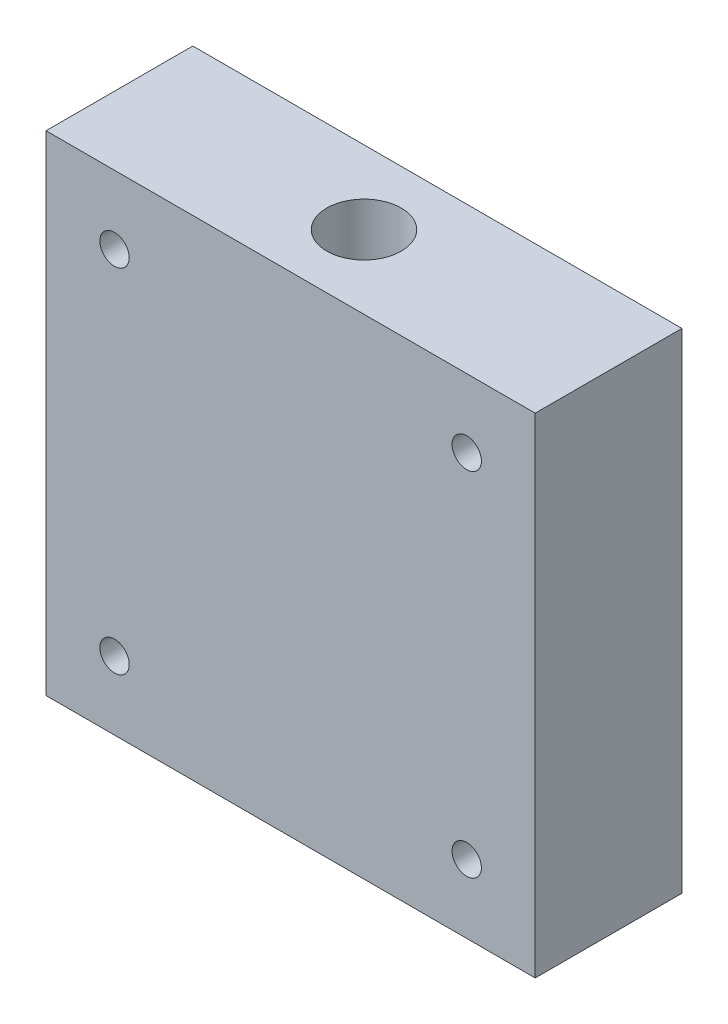
ISO-10303-21;
HEADER;
FILE_DESCRIPTION(('STEP AP214'),'2;1');
FILE_NAME('part.step','',(''),(''),'','','');
FILE_SCHEMA(('AUTOMOTIVE_DESIGN { 1 0 10303 214 1 1 1 1 }'));
ENDSEC;
DATA;
#1=APPLICATION_CONTEXT('core data for automotive mechanical design processes');
#2=APPLICATION_PROTOCOL_DEFINITION('international standard','automotive_design',2000,#1);
#3=PRODUCT_CONTEXT('',#1,'mechanical');
#4=PRODUCT('Part','Part','',(#3));
#5=PRODUCT_RELATED_PRODUCT_CATEGORY('part','',(#4));
#6=PRODUCT_DEFINITION_FORMATION('','',#4);
#7=PRODUCT_DEFINITION_CONTEXT('part definition',#1,'design');
#8=PRODUCT_DEFINITION('design','',#6,#7);
#9=PRODUCT_DEFINITION_SHAPE('','',#8);
#10=(LENGTH_UNIT() NAMED_UNIT(*) SI_UNIT(.MILLI.,.METRE.));
#11=(NAMED_UNIT(*) PLANE_ANGLE_UNIT() SI_UNIT($,.RADIAN.));
#12=(NAMED_UNIT(*) SI_UNIT($,.STERADIAN.) SOLID_ANGLE_UNIT());
#13=UNCERTAINTY_MEASURE_WITH_UNIT(LENGTH_MEASURE(1.E-05),#10,'distance_accuracy_value','');
#14=(GEOMETRIC_REPRESENTATION_CONTEXT(3) GLOBAL_UNCERTAINTY_ASSIGNED_CONTEXT((#13)) GLOBAL_UNIT_ASSIGNED_CONTEXT((#10,
#11,#12)) REPRESENTATION_CONTEXT('',''));
#15=CARTESIAN_POINT('',(0.,0.,0.));
#16=DIRECTION('',(0.,0.,1.));
#17=DIRECTION('',(1.,0.,0.));
#18=AXIS2_PLACEMENT_3D('',#15,#16,#17);
#19=CARTESIAN_POINT('',(-25.,-25.,15.));
#20=DIRECTION('',(1.,0.,0.));
#21=DIRECTION('',(0.,0.,-1.));
#22=AXIS2_PLACEMENT_3D('',#19,#20,#21);
#23=PLANE('',#22);
#24=DIRECTION('',(0.,-1.,0.));
#25=VECTOR('',#24,1.);
#26=CARTESIAN_POINT('',(-25.,-25.,0.));
#27=LINE('',#26,#25);
#28=CARTESIAN_POINT('',(-25.,25.,0.));
#29=VERTEX_POINT('',#28);
#30=CARTESIAN_POINT('',(-25.,-25.,0.));
#31=VERTEX_POINT('',#30);
#32=EDGE_CURVE('E112',#29,#31,#27,.T.);
#33=ORIENTED_EDGE('',*,*,#32,.T.);
#34=DIRECTION('',(0.,0.,-1.));
#35=VECTOR('',#34,1.);
#36=CARTESIAN_POINT('',(-25.,-25.,15.));
#37=LINE('',#36,#35);
#38=CARTESIAN_POINT('',(-25.,-25.,15.));
#39=VERTEX_POINT('',#38);
#40=EDGE_CURVE('E11',#39,#31,#37,.T.);
#41=ORIENTED_EDGE('',*,*,#40,.F.);
#42=DIRECTION('',(0.,-1.,0.));
#43=VECTOR('',#42,1.);
#44=CARTESIAN_POINT('',(-25.,-25.,15.));
#45=LINE('',#44,#43);
#46=CARTESIAN_POINT('',(-25.,25.,15.));
#47=VERTEX_POINT('',#46);
#48=EDGE_CURVE('E96',#47,#39,#45,.T.);
#49=ORIENTED_EDGE('',*,*,#48,.F.);
#50=DIRECTION('',(0.,0.,-1.));
#51=VECTOR('',#50,1.);
#52=CARTESIAN_POINT('',(-25.,25.,15.));
#53=LINE('',#52,#51);
#54=EDGE_CURVE('E108',#47,#29,#53,.T.);
#55=ORIENTED_EDGE('',*,*,#54,.T.);
#56=EDGE_LOOP('',(#33,#41,#49,#55));
#57=FACE_BOUND('',#56,.T.);
#58=ADVANCED_FACE('F44',(#57),#23,.F.);
#59=CARTESIAN_POINT('',(25.,-25.,15.));
#60=DIRECTION('',(0.,1.,0.));
#61=DIRECTION('',(-1.,0.,0.));
#62=AXIS2_PLACEMENT_3D('',#59,#60,#61);
#63=PLANE('',#62);
#64=DIRECTION('',(1.,0.,0.));
#65=VECTOR('',#64,1.);
#66=CARTESIAN_POINT('',(25.,-25.,0.));
#67=LINE('',#66,#65);
#68=CARTESIAN_POINT('',(25.,-25.,0.));
#69=VERTEX_POINT('',#68);
#70=EDGE_CURVE('E101',#31,#69,#67,.T.);
#71=ORIENTED_EDGE('',*,*,#70,.T.);
#72=DIRECTION('',(0.,0.,-1.));
#73=VECTOR('',#72,1.);
#74=CARTESIAN_POINT('',(25.,-25.,15.));
#75=LINE('',#74,#73);
#76=CARTESIAN_POINT('',(25.,-25.,15.));
#77=VERTEX_POINT('',#76);
#78=EDGE_CURVE('E53',#77,#69,#75,.T.);
#79=ORIENTED_EDGE('',*,*,#78,.F.);
#80=DIRECTION('',(1.,0.,0.));
#81=VECTOR('',#80,1.);
#82=CARTESIAN_POINT('',(25.,-25.,15.));
#83=LINE('',#82,#81);
#84=EDGE_CURVE('E91',#39,#77,#83,.T.);
#85=ORIENTED_EDGE('',*,*,#84,.F.);
#86=ORIENTED_EDGE('',*,*,#40,.T.);
#87=EDGE_LOOP('',(#71,#79,#85,#86));
#88=FACE_BOUND('',#87,.T.);
#89=ADVANCED_FACE('F100',(#88),#63,.F.);
#90=CARTESIAN_POINT('',(25.,-25.,15.));
#91=DIRECTION('',(-1.,0.,0.));
#92=DIRECTION('',(0.,0.,1.));
#93=AXIS2_PLACEMENT_3D('',#90,#91,#92);
#94=PLANE('',#93);
#95=DIRECTION('',(0.,1.,0.));
#96=VECTOR('',#95,1.);
#97=CARTESIAN_POINT('',(25.,-25.,0.));
#98=LINE('',#97,#96);
#99=CARTESIAN_POINT('',(25.,25.,0.));
#100=VERTEX_POINT('',#99);
#101=EDGE_CURVE('E78',#69,#100,#98,.T.);
#102=ORIENTED_EDGE('',*,*,#101,.T.);
#103=DIRECTION('',(0.,0.,-1.));
#104=VECTOR('',#103,1.);
#105=CARTESIAN_POINT('',(25.,25.,15.));
#106=LINE('',#105,#104);
#107=CARTESIAN_POINT('',(25.,25.,15.));
#108=VERTEX_POINT('',#107);
#109=EDGE_CURVE('E103',#108,#100,#106,.T.);
#110=ORIENTED_EDGE('',*,*,#109,.F.);
#111=DIRECTION('',(0.,1.,0.));
#112=VECTOR('',#111,1.);
#113=CARTESIAN_POINT('',(25.,-25.,15.));
#114=LINE('',#113,#112);
#115=EDGE_CURVE('E94',#77,#108,#114,.T.);
#116=ORIENTED_EDGE('',*,*,#115,.F.);
#117=ORIENTED_EDGE('',*,*,#78,.T.);
#118=EDGE_LOOP('',(#102,#110,#116,#117));
#119=FACE_BOUND('',#118,.T.);
#120=ADVANCED_FACE('F104',(#119),#94,.F.);
#121=CARTESIAN_POINT('',(25.,25.,15.));
#122=DIRECTION('',(0.,-1.,0.));
#123=DIRECTION('',(1.,0.,0.));
#124=AXIS2_PLACEMENT_3D('',#121,#122,#123);
#125=PLANE('',#124);
#126=CARTESIAN_POINT('',(0.,25.,7.5));
#127=DIRECTION('',(0.,1.,0.));
#128=DIRECTION('',(-1.,0.,0.));
#129=AXIS2_PLACEMENT_3D('',#126,#127,#128);
#130=CIRCLE('',#129,3.815);
#131=CARTESIAN_POINT('',(-3.815,25.,7.5));
#132=VERTEX_POINT('',#131);
#133=EDGE_CURVE('E133',#132,#132,#130,.T.);
#134=ORIENTED_EDGE('',*,*,#133,.F.);
#135=EDGE_LOOP('',(#134));
#136=FACE_BOUND('',#135,.T.);
#137=DIRECTION('',(-1.,0.,0.));
#138=VECTOR('',#137,1.);
#139=CARTESIAN_POINT('',(25.,25.,0.));
#140=LINE('',#139,#138);
#141=EDGE_CURVE('E84',#100,#29,#140,.T.);
#142=ORIENTED_EDGE('',*,*,#141,.T.);
#143=ORIENTED_EDGE('',*,*,#54,.F.);
#144=DIRECTION('',(-1.,0.,0.));
#145=VECTOR('',#144,1.);
#146=CARTESIAN_POINT('',(25.,25.,15.));
#147=LINE('',#146,#145);
#148=EDGE_CURVE('E61',#108,#47,#147,.T.);
#149=ORIENTED_EDGE('',*,*,#148,.F.);
#150=ORIENTED_EDGE('',*,*,#109,.T.);
#151=EDGE_LOOP('',(#142,#143,#149,#150));
#152=FACE_BOUND('',#151,.T.);
#153=ADVANCED_FACE('F126',(#136,#152),#125,.F.);
#154=CARTESIAN_POINT('',(0.,0.,15.));
#155=DIRECTION('',(0.,0.,1.));
#156=DIRECTION('',(1.,0.,0.));
#157=AXIS2_PLACEMENT_3D('',#154,#155,#156);
#158=PLANE('',#157);
#159=CARTESIAN_POINT('',(-18.,-18.,15.));
#160=DIRECTION('',(0.,0.,1.));
#161=DIRECTION('',(1.,0.,0.));
#162=AXIS2_PLACEMENT_3D('',#159,#160,#161);
#163=CIRCLE('',#162,1.5);
#164=CARTESIAN_POINT('',(-16.5,-18.,15.));
#165=VERTEX_POINT('',#164);
#166=EDGE_CURVE('E145',#165,#165,#163,.T.);
#167=ORIENTED_EDGE('',*,*,#166,.F.);
#168=EDGE_LOOP('',(#167));
#169=FACE_BOUND('',#168,.T.);
#170=CARTESIAN_POINT('',(18.,18.,15.));
#171=DIRECTION('',(0.,0.,1.));
#172=DIRECTION('',(1.,0.,0.));
#173=AXIS2_PLACEMENT_3D('',#170,#171,#172);
#174=CIRCLE('',#173,1.5);
#175=CARTESIAN_POINT('',(19.5,18.,15.));
#176=VERTEX_POINT('',#175);
#177=EDGE_CURVE('E153',#176,#176,#174,.T.);
#178=ORIENTED_EDGE('',*,*,#177,.F.);
#179=EDGE_LOOP('',(#178));
#180=FACE_BOUND('',#179,.T.);
#181=CARTESIAN_POINT('',(18.,-18.,15.));
#182=DIRECTION('',(0.,0.,1.));
#183=DIRECTION('',(1.,0.,0.));
#184=AXIS2_PLACEMENT_3D('',#181,#182,#183);
#185=CIRCLE('',#184,1.5);
#186=CARTESIAN_POINT('',(19.5,-18.,15.));
#187=VERTEX_POINT('',#186);
#188=EDGE_CURVE('E154',#187,#187,#185,.T.);
#189=ORIENTED_EDGE('',*,*,#188,.F.);
#190=EDGE_LOOP('',(#189));
#191=FACE_BOUND('',#190,.T.);
#192=CARTESIAN_POINT('',(-18.,18.,15.));
#193=DIRECTION('',(0.,0.,1.));
#194=DIRECTION('',(1.,0.,0.));
#195=AXIS2_PLACEMENT_3D('',#192,#193,#194);
#196=CIRCLE('',#195,1.5);
#197=CARTESIAN_POINT('',(-16.5,18.,15.));
#198=VERTEX_POINT('',#197);
#199=EDGE_CURVE('E141',#198,#198,#196,.T.);
#200=ORIENTED_EDGE('',*,*,#199,.F.);
#201=EDGE_LOOP('',(#200));
#202=FACE_BOUND('',#201,.T.);
#203=ORIENTED_EDGE('',*,*,#48,.T.);
#204=ORIENTED_EDGE('',*,*,#84,.T.);
#205=ORIENTED_EDGE('',*,*,#115,.T.);
#206=ORIENTED_EDGE('',*,*,#148,.T.);
#207=EDGE_LOOP('',(#203,#204,#205,#206));
#208=FACE_BOUND('',#207,.T.);
#209=ADVANCED_FACE('F92',(#169,#180,#191,#202,#208),#158,.T.);
#210=CARTESIAN_POINT('',(0.,0.,0.));
#211=DIRECTION('',(0.,0.,1.));
#212=DIRECTION('',(1.,0.,0.));
#213=AXIS2_PLACEMENT_3D('',#210,#211,#212);
#214=PLANE('',#213);
#215=CARTESIAN_POINT('',(-18.,-18.,0.));
#216=DIRECTION('',(0.,0.,1.));
#217=DIRECTION('',(1.,0.,0.));
#218=AXIS2_PLACEMENT_3D('',#215,#216,#217);
#219=CIRCLE('',#218,1.5);
#220=CARTESIAN_POINT('',(-16.5,-18.,0.));
#221=VERTEX_POINT('',#220);
#222=EDGE_CURVE('E158',#221,#221,#219,.T.);
#223=ORIENTED_EDGE('',*,*,#222,.T.);
#224=EDGE_LOOP('',(#223));
#225=FACE_BOUND('',#224,.T.);
#226=CARTESIAN_POINT('',(18.,18.,0.));
#227=DIRECTION('',(0.,0.,1.));
#228=DIRECTION('',(1.,0.,0.));
#229=AXIS2_PLACEMENT_3D('',#226,#227,#228);
#230=CIRCLE('',#229,1.5);
#231=CARTESIAN_POINT('',(19.5,18.,0.));
#232=VERTEX_POINT('',#231);
#233=EDGE_CURVE('E149',#232,#232,#230,.T.);
#234=ORIENTED_EDGE('',*,*,#233,.T.);
#235=EDGE_LOOP('',(#234));
#236=FACE_BOUND('',#235,.T.);
#237=CARTESIAN_POINT('',(18.,-18.,0.));
#238=DIRECTION('',(0.,0.,1.));
#239=DIRECTION('',(1.,0.,0.));
#240=AXIS2_PLACEMENT_3D('',#237,#238,#239);
#241=CIRCLE('',#240,1.5);
#242=CARTESIAN_POINT('',(19.5,-18.,0.));
#243=VERTEX_POINT('',#242);
#244=EDGE_CURVE('E165',#243,#243,#241,.T.);
#245=ORIENTED_EDGE('',*,*,#244,.T.);
#246=EDGE_LOOP('',(#245));
#247=FACE_BOUND('',#246,.T.);
#248=CARTESIAN_POINT('',(-18.,18.,0.));
#249=DIRECTION('',(0.,0.,1.));
#250=DIRECTION('',(1.,0.,0.));
#251=AXIS2_PLACEMENT_3D('',#248,#249,#250);
#252=CIRCLE('',#251,1.5);
#253=CARTESIAN_POINT('',(-16.5,18.,0.));
#254=VERTEX_POINT('',#253);
#255=EDGE_CURVE('E137',#254,#254,#252,.T.);
#256=ORIENTED_EDGE('',*,*,#255,.T.);
#257=EDGE_LOOP('',(#256));
#258=FACE_BOUND('',#257,.T.);
#259=ORIENTED_EDGE('',*,*,#32,.F.);
#260=ORIENTED_EDGE('',*,*,#141,.F.);
#261=ORIENTED_EDGE('',*,*,#101,.F.);
#262=ORIENTED_EDGE('',*,*,#70,.F.);
#263=EDGE_LOOP('',(#259,#260,#261,#262));
#264=FACE_BOUND('',#263,.T.);
#265=ADVANCED_FACE('F129',(#225,#236,#247,#258,#264),#214,.F.);
#266=CARTESIAN_POINT('',(0.,5.,7.5));
#267=DIRECTION('',(0.,1.,0.));
#268=DIRECTION('',(-1.,0.,0.));
#269=AXIS2_PLACEMENT_3D('',#266,#267,#268);
#270=CYLINDRICAL_SURFACE('',#269,3.815);
#271=CARTESIAN_POINT('',(0.,5.,7.5));
#272=DIRECTION('',(0.,1.,0.));
#273=DIRECTION('',(-1.,0.,0.));
#274=AXIS2_PLACEMENT_3D('',#271,#272,#273);
#275=CIRCLE('',#274,3.815);
#276=CARTESIAN_POINT('',(-3.815,5.,7.5));
#277=VERTEX_POINT('',#276);
#278=EDGE_CURVE('E116',#277,#277,#275,.T.);
#279=ORIENTED_EDGE('',*,*,#278,.F.);
#280=EDGE_LOOP('',(#279));
#281=FACE_BOUND('',#280,.T.);
#282=ORIENTED_EDGE('',*,*,#133,.T.);
#283=EDGE_LOOP('',(#282));
#284=FACE_BOUND('',#283,.T.);
#285=ADVANCED_FACE('F194',(#281,#284),#270,.F.);
#286=CARTESIAN_POINT('',(0.,5.,7.5));
#287=DIRECTION('',(0.,1.,0.));
#288=DIRECTION('',(-1.,0.,0.));
#289=AXIS2_PLACEMENT_3D('',#286,#287,#288);
#290=PLANE('',#289);
#291=ORIENTED_EDGE('',*,*,#278,.T.);
#292=EDGE_LOOP('',(#291));
#293=FACE_BOUND('',#292,.T.);
#294=ADVANCED_FACE('F183',(#293),#290,.T.);
#295=CARTESIAN_POINT('',(-18.,18.,0.));
#296=DIRECTION('',(0.,0.,1.));
#297=DIRECTION('',(1.,0.,0.));
#298=AXIS2_PLACEMENT_3D('',#295,#296,#297);
#299=CYLINDRICAL_SURFACE('',#298,1.5);
#300=ORIENTED_EDGE('',*,*,#255,.F.);
#301=EDGE_LOOP('',(#300));
#302=FACE_BOUND('',#301,.T.);
#303=ORIENTED_EDGE('',*,*,#199,.T.);
#304=EDGE_LOOP('',(#303));
#305=FACE_BOUND('',#304,.T.);
#306=ADVANCED_FACE('F181',(#302,#305),#299,.F.);
#307=CARTESIAN_POINT('',(18.,-18.,0.));
#308=DIRECTION('',(0.,0.,1.));
#309=DIRECTION('',(1.,0.,0.));
#310=AXIS2_PLACEMENT_3D('',#307,#308,#309);
#311=CYLINDRICAL_SURFACE('',#310,1.5);
#312=ORIENTED_EDGE('',*,*,#244,.F.);
#313=EDGE_LOOP('',(#312));
#314=FACE_BOUND('',#313,.T.);
#315=ORIENTED_EDGE('',*,*,#188,.T.);
#316=EDGE_LOOP('',(#315));
#317=FACE_BOUND('',#316,.T.);
#318=ADVANCED_FACE('F173',(#314,#317),#311,.F.);
#319=CARTESIAN_POINT('',(18.,18.,0.));
#320=DIRECTION('',(0.,0.,1.));
#321=DIRECTION('',(1.,0.,0.));
#322=AXIS2_PLACEMENT_3D('',#319,#320,#321);
#323=CYLINDRICAL_SURFACE('',#322,1.5);
#324=ORIENTED_EDGE('',*,*,#233,.F.);
#325=EDGE_LOOP('',(#324));
#326=FACE_BOUND('',#325,.T.);
#327=ORIENTED_EDGE('',*,*,#177,.T.);
#328=EDGE_LOOP('',(#327));
#329=FACE_BOUND('',#328,.T.);
#330=ADVANCED_FACE('F190',(#326,#329),#323,.F.);
#331=CARTESIAN_POINT('',(-18.,-18.,0.));
#332=DIRECTION('',(0.,0.,1.));
#333=DIRECTION('',(1.,0.,0.));
#334=AXIS2_PLACEMENT_3D('',#331,#332,#333);
#335=CYLINDRICAL_SURFACE('',#334,1.5);
#336=ORIENTED_EDGE('',*,*,#222,.F.);
#337=EDGE_LOOP('',(#336));
#338=FACE_BOUND('',#337,.T.);
#339=ORIENTED_EDGE('',*,*,#166,.T.);
#340=EDGE_LOOP('',(#339));
#341=FACE_BOUND('',#340,.T.);
#342=ADVANCED_FACE('F259',(#338,#341),#335,.F.);
#343=CLOSED_SHELL('',(#58,#89,#120,#153,#209,#265,#285,#294,#306,#318,#330,#342));
#344=MANIFOLD_SOLID_BREP('B2',#343);
#345=ADVANCED_BREP_SHAPE_REPRESENTATION('',(#18,#344),#14);
#346=SHAPE_DEFINITION_REPRESENTATION(#9,#345);
ENDSEC;
END-ISO-10303-21;
